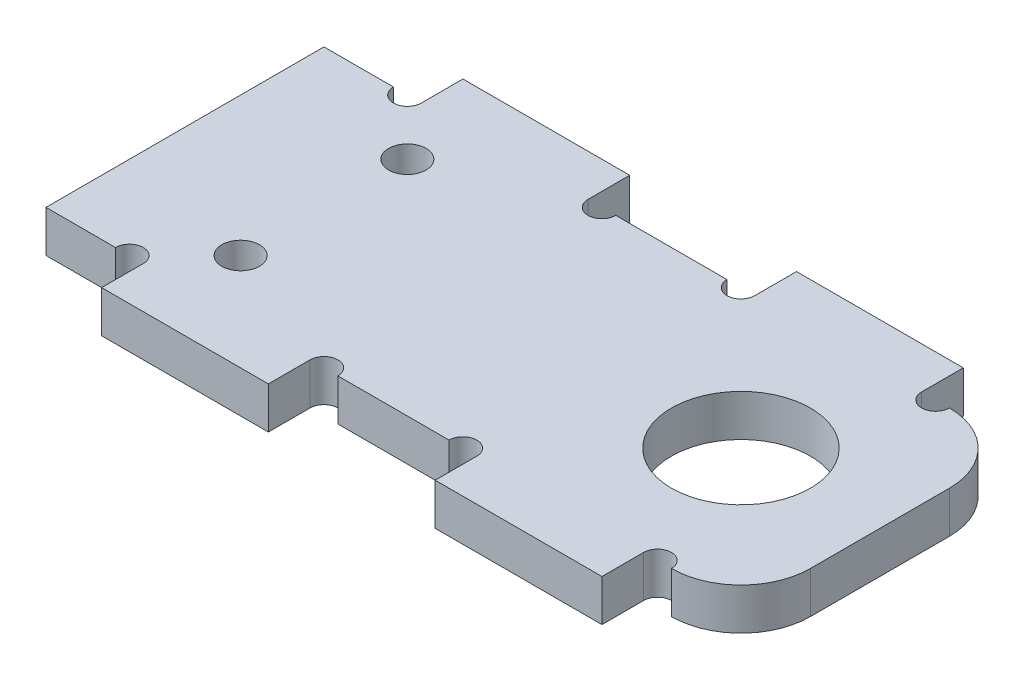
ISO-10303-21;
HEADER;
FILE_DESCRIPTION(('STEP AP214'),'2;1');
FILE_NAME('part.step','',(''),(''),'','','');
FILE_SCHEMA(('AUTOMOTIVE_DESIGN { 1 0 10303 214 1 1 1 1 }'));
ENDSEC;
DATA;
#1=APPLICATION_CONTEXT('core data for automotive mechanical design processes');
#2=APPLICATION_PROTOCOL_DEFINITION('international standard','automotive_design',2000,#1);
#3=PRODUCT_CONTEXT('',#1,'mechanical');
#4=PRODUCT('Part','Part','',(#3));
#5=PRODUCT_RELATED_PRODUCT_CATEGORY('part','',(#4));
#6=PRODUCT_DEFINITION_FORMATION('','',#4);
#7=PRODUCT_DEFINITION_CONTEXT('part definition',#1,'design');
#8=PRODUCT_DEFINITION('design','',#6,#7);
#9=PRODUCT_DEFINITION_SHAPE('','',#8);
#10=(LENGTH_UNIT() NAMED_UNIT(*) SI_UNIT(.MILLI.,.METRE.));
#11=(NAMED_UNIT(*) PLANE_ANGLE_UNIT() SI_UNIT($,.RADIAN.));
#12=(NAMED_UNIT(*) SI_UNIT($,.STERADIAN.) SOLID_ANGLE_UNIT());
#13=UNCERTAINTY_MEASURE_WITH_UNIT(LENGTH_MEASURE(1.E-05),#10,'distance_accuracy_value','');
#14=(GEOMETRIC_REPRESENTATION_CONTEXT(3) GLOBAL_UNCERTAINTY_ASSIGNED_CONTEXT((#13)) GLOBAL_UNIT_ASSIGNED_CONTEXT((#10,
#11,#12)) REPRESENTATION_CONTEXT('',''));
#15=CARTESIAN_POINT('',(0.,0.,0.));
#16=DIRECTION('',(0.,0.,1.));
#17=DIRECTION('',(1.,0.,0.));
#18=AXIS2_PLACEMENT_3D('',#15,#16,#17);
#19=CARTESIAN_POINT('',(-30.,3.,-10.));
#20=DIRECTION('',(0.,0.,1.));
#21=DIRECTION('',(1.,0.,0.));
#22=AXIS2_PLACEMENT_3D('',#19,#20,#21);
#23=PLANE('',#22);
#24=DIRECTION('',(-1.,0.,0.));
#25=VECTOR('',#24,1.);
#26=CARTESIAN_POINT('',(-10.,3.,-10.));
#27=LINE('',#26,#25);
#28=CARTESIAN_POINT('',(-35.,3.,-10.));
#29=VERTEX_POINT('',#28);
#30=CARTESIAN_POINT('',(-40.,3.,-10.));
#31=VERTEX_POINT('',#30);
#32=EDGE_CURVE('E442',#29,#31,#27,.T.);
#33=ORIENTED_EDGE('',*,*,#32,.F.);
#34=DIRECTION('',(0.,-1.,0.));
#35=VECTOR('',#34,1.);
#36=CARTESIAN_POINT('',(-35.,3.,-10.));
#37=LINE('',#36,#35);
#38=CARTESIAN_POINT('',(-35.,0.,-10.));
#39=VERTEX_POINT('',#38);
#40=EDGE_CURVE('E229',#29,#39,#37,.T.);
#41=ORIENTED_EDGE('',*,*,#40,.T.);
#42=DIRECTION('',(-1.,0.,0.));
#43=VECTOR('',#42,1.);
#44=CARTESIAN_POINT('',(-30.,0.,-10.));
#45=LINE('',#44,#43);
#46=CARTESIAN_POINT('',(-40.,0.,-10.));
#47=VERTEX_POINT('',#46);
#48=EDGE_CURVE('E248',#39,#47,#45,.T.);
#49=ORIENTED_EDGE('',*,*,#48,.T.);
#50=DIRECTION('',(0.,-1.,0.));
#51=VECTOR('',#50,1.);
#52=CARTESIAN_POINT('',(-40.,3.,-10.));
#53=LINE('',#52,#51);
#54=EDGE_CURVE('E264',#31,#47,#53,.T.);
#55=ORIENTED_EDGE('',*,*,#54,.F.);
#56=EDGE_LOOP('',(#33,#41,#49,#55));
#57=FACE_BOUND('',#56,.T.);
#58=ADVANCED_FACE('F35',(#57),#23,.F.);
#59=CARTESIAN_POINT('',(-10.,3.,10.));
#60=DIRECTION('',(0.,0.,-1.));
#61=DIRECTION('',(-1.,0.,0.));
#62=AXIS2_PLACEMENT_3D('',#59,#60,#61);
#63=PLANE('',#62);
#64=DIRECTION('',(1.,0.,0.));
#65=VECTOR('',#64,1.);
#66=CARTESIAN_POINT('',(-10.,0.,10.));
#67=LINE('',#66,#65);
#68=CARTESIAN_POINT('',(-40.,0.,10.));
#69=VERTEX_POINT('',#68);
#70=CARTESIAN_POINT('',(-35.,0.,10.));
#71=VERTEX_POINT('',#70);
#72=EDGE_CURVE('E257',#69,#71,#67,.T.);
#73=ORIENTED_EDGE('',*,*,#72,.T.);
#74=DIRECTION('',(0.,-1.,0.));
#75=VECTOR('',#74,1.);
#76=CARTESIAN_POINT('',(-35.,3.,10.));
#77=LINE('',#76,#75);
#78=CARTESIAN_POINT('',(-35.,3.,10.));
#79=VERTEX_POINT('',#78);
#80=EDGE_CURVE('E329',#71,#79,#77,.F.);
#81=ORIENTED_EDGE('',*,*,#80,.T.);
#82=DIRECTION('',(1.,0.,0.));
#83=VECTOR('',#82,1.);
#84=CARTESIAN_POINT('',(-40.,3.,10.));
#85=LINE('',#84,#83);
#86=CARTESIAN_POINT('',(-40.,3.,10.));
#87=VERTEX_POINT('',#86);
#88=EDGE_CURVE('E265',#87,#79,#85,.T.);
#89=ORIENTED_EDGE('',*,*,#88,.F.);
#90=DIRECTION('',(0.,-1.,0.));
#91=VECTOR('',#90,1.);
#92=CARTESIAN_POINT('',(-40.,3.,10.));
#93=LINE('',#92,#91);
#94=EDGE_CURVE('E261',#87,#69,#93,.T.);
#95=ORIENTED_EDGE('',*,*,#94,.T.);
#96=EDGE_LOOP('',(#73,#81,#89,#95));
#97=FACE_BOUND('',#96,.T.);
#98=ADVANCED_FACE('F492',(#97),#63,.F.);
#99=CARTESIAN_POINT('',(0.,3.,0.));
#100=DIRECTION('',(0.,-1.,0.));
#101=DIRECTION('',(0.,0.,-1.));
#102=AXIS2_PLACEMENT_3D('',#99,#100,#101);
#103=PLANE('',#102);
#104=DIRECTION('',(0.,0.,-1.));
#105=VECTOR('',#104,1.);
#106=CARTESIAN_POINT('',(-21.,3.,10.));
#107=LINE('',#106,#105);
#108=CARTESIAN_POINT('',(-21.,3.,13.));
#109=VERTEX_POINT('',#108);
#110=CARTESIAN_POINT('',(-21.,3.,10.));
#111=VERTEX_POINT('',#110);
#112=EDGE_CURVE('E400',#109,#111,#107,.T.);
#113=ORIENTED_EDGE('',*,*,#112,.T.);
#114=CARTESIAN_POINT('',(-20.,3.,10.));
#115=DIRECTION('',(0.,-1.,0.));
#116=DIRECTION('',(0.,0.,1.));
#117=AXIS2_PLACEMENT_3D('',#114,#115,#116);
#118=CIRCLE('',#117,1.);
#119=CARTESIAN_POINT('',(-19.,3.,10.));
#120=VERTEX_POINT('',#119);
#121=EDGE_CURVE('E318',#111,#120,#118,.T.);
#122=ORIENTED_EDGE('',*,*,#121,.T.);
#123=CARTESIAN_POINT('',(-11.,3.,10.));
#124=VERTEX_POINT('',#123);
#125=EDGE_CURVE('E446',#120,#124,#85,.T.);
#126=ORIENTED_EDGE('',*,*,#125,.T.);
#127=CARTESIAN_POINT('',(-10.,3.,10.));
#128=DIRECTION('',(0.,-1.,0.));
#129=DIRECTION('',(0.,0.,-1.));
#130=AXIS2_PLACEMENT_3D('',#127,#128,#129);
#131=CIRCLE('',#130,1.);
#132=CARTESIAN_POINT('',(-9.,3.,10.));
#133=VERTEX_POINT('',#132);
#134=EDGE_CURVE('E453',#124,#133,#131,.T.);
#135=ORIENTED_EDGE('',*,*,#134,.T.);
#136=DIRECTION('',(0.,0.,1.));
#137=VECTOR('',#136,1.);
#138=CARTESIAN_POINT('',(-9.,3.,10.));
#139=LINE('',#138,#137);
#140=CARTESIAN_POINT('',(-9.,3.,13.));
#141=VERTEX_POINT('',#140);
#142=EDGE_CURVE('E375',#133,#141,#139,.T.);
#143=ORIENTED_EDGE('',*,*,#142,.T.);
#144=DIRECTION('',(1.,0.,0.));
#145=VECTOR('',#144,1.);
#146=CARTESIAN_POINT('',(3.,3.,13.));
#147=LINE('',#146,#145);
#148=CARTESIAN_POINT('',(3.,3.,13.));
#149=VERTEX_POINT('',#148);
#150=EDGE_CURVE('E381',#141,#149,#147,.T.);
#151=ORIENTED_EDGE('',*,*,#150,.T.);
#152=DIRECTION('',(0.,0.,-1.));
#153=VECTOR('',#152,1.);
#154=CARTESIAN_POINT('',(3.,3.,10.));
#155=LINE('',#154,#153);
#156=CARTESIAN_POINT('',(3.,3.,10.));
#157=VERTEX_POINT('',#156);
#158=EDGE_CURVE('E377',#149,#157,#155,.T.);
#159=ORIENTED_EDGE('',*,*,#158,.T.);
#160=CARTESIAN_POINT('',(3.99999999999999,3.,10.));
#161=DIRECTION('',(0.,-1.,0.));
#162=DIRECTION('',(0.,0.,1.));
#163=AXIS2_PLACEMENT_3D('',#160,#161,#162);
#164=CIRCLE('',#163,1.);
#165=CARTESIAN_POINT('',(4.99999999999999,3.,10.));
#166=VERTEX_POINT('',#165);
#167=EDGE_CURVE('E464',#157,#166,#164,.T.);
#168=ORIENTED_EDGE('',*,*,#167,.T.);
#169=CARTESIAN_POINT('',(5.,3.,5.));
#170=DIRECTION('',(0.,-1.,0.));
#171=DIRECTION('',(0.,0.,-1.));
#172=AXIS2_PLACEMENT_3D('',#169,#170,#171);
#173=CIRCLE('',#172,5.);
#174=CARTESIAN_POINT('',(10.,3.,5.));
#175=VERTEX_POINT('',#174);
#176=EDGE_CURVE('E280',#166,#175,#173,.F.);
#177=ORIENTED_EDGE('',*,*,#176,.T.);
#178=DIRECTION('',(0.,0.,-1.));
#179=VECTOR('',#178,1.);
#180=CARTESIAN_POINT('',(10.,3.,10.));
#181=LINE('',#180,#179);
#182=CARTESIAN_POINT('',(10.,3.,-5.));
#183=VERTEX_POINT('',#182);
#184=EDGE_CURVE('E260',#175,#183,#181,.T.);
#185=ORIENTED_EDGE('',*,*,#184,.T.);
#186=CARTESIAN_POINT('',(5.,3.,-5.));
#187=DIRECTION('',(0.,-1.,0.));
#188=DIRECTION('',(0.,0.,-1.));
#189=AXIS2_PLACEMENT_3D('',#186,#187,#188);
#190=CIRCLE('',#189,5.);
#191=CARTESIAN_POINT('',(5.,3.,-10.));
#192=VERTEX_POINT('',#191);
#193=EDGE_CURVE('E43',#183,#192,#190,.F.);
#194=ORIENTED_EDGE('',*,*,#193,.T.);
#195=CARTESIAN_POINT('',(4.,3.,-10.));
#196=DIRECTION('',(0.,-1.,0.));
#197=DIRECTION('',(0.,0.,-1.));
#198=AXIS2_PLACEMENT_3D('',#195,#196,#197);
#199=CIRCLE('',#198,1.);
#200=CARTESIAN_POINT('',(3.,3.,-10.));
#201=VERTEX_POINT('',#200);
#202=EDGE_CURVE('E290',#192,#201,#199,.T.);
#203=ORIENTED_EDGE('',*,*,#202,.T.);
#204=DIRECTION('',(0.,0.,-1.));
#205=VECTOR('',#204,1.);
#206=CARTESIAN_POINT('',(3.,3.,-10.));
#207=LINE('',#206,#205);
#208=CARTESIAN_POINT('',(3.,3.,-13.));
#209=VERTEX_POINT('',#208);
#210=EDGE_CURVE('E356',#201,#209,#207,.T.);
#211=ORIENTED_EDGE('',*,*,#210,.T.);
#212=DIRECTION('',(-1.,0.,0.));
#213=VECTOR('',#212,1.);
#214=CARTESIAN_POINT('',(3.,3.,-13.));
#215=LINE('',#214,#213);
#216=CARTESIAN_POINT('',(-9.,3.,-13.));
#217=VERTEX_POINT('',#216);
#218=EDGE_CURVE('E354',#209,#217,#215,.T.);
#219=ORIENTED_EDGE('',*,*,#218,.T.);
#220=DIRECTION('',(0.,0.,1.));
#221=VECTOR('',#220,1.);
#222=CARTESIAN_POINT('',(-9.,3.,-10.));
#223=LINE('',#222,#221);
#224=CARTESIAN_POINT('',(-9.,3.,-10.));
#225=VERTEX_POINT('',#224);
#226=EDGE_CURVE('E359',#217,#225,#223,.T.);
#227=ORIENTED_EDGE('',*,*,#226,.T.);
#228=CARTESIAN_POINT('',(-10.,3.,-10.));
#229=DIRECTION('',(0.,-1.,0.));
#230=DIRECTION('',(0.,0.,1.));
#231=AXIS2_PLACEMENT_3D('',#228,#229,#230);
#232=CIRCLE('',#231,1.00000000000001);
#233=CARTESIAN_POINT('',(-11.,3.,-10.));
#234=VERTEX_POINT('',#233);
#235=EDGE_CURVE('E58',#225,#234,#232,.T.);
#236=ORIENTED_EDGE('',*,*,#235,.T.);
#237=CARTESIAN_POINT('',(-19.,3.,-10.));
#238=VERTEX_POINT('',#237);
#239=EDGE_CURVE('E444',#234,#238,#27,.T.);
#240=ORIENTED_EDGE('',*,*,#239,.T.);
#241=CARTESIAN_POINT('',(-20.,3.,-10.));
#242=DIRECTION('',(0.,-1.,0.));
#243=DIRECTION('',(0.,0.,-1.));
#244=AXIS2_PLACEMENT_3D('',#241,#242,#243);
#245=CIRCLE('',#244,1.00000000000001);
#246=CARTESIAN_POINT('',(-21.,3.,-10.));
#247=VERTEX_POINT('',#246);
#248=EDGE_CURVE('E224',#238,#247,#245,.T.);
#249=ORIENTED_EDGE('',*,*,#248,.T.);
#250=DIRECTION('',(0.,0.,-1.));
#251=VECTOR('',#250,1.);
#252=CARTESIAN_POINT('',(-21.,3.,-10.));
#253=LINE('',#252,#251);
#254=CARTESIAN_POINT('',(-21.,3.,-13.));
#255=VERTEX_POINT('',#254);
#256=EDGE_CURVE('E333',#247,#255,#253,.T.);
#257=ORIENTED_EDGE('',*,*,#256,.T.);
#258=DIRECTION('',(-1.,0.,0.));
#259=VECTOR('',#258,1.);
#260=CARTESIAN_POINT('',(-33.,3.,-13.));
#261=LINE('',#260,#259);
#262=CARTESIAN_POINT('',(-33.,3.,-13.));
#263=VERTEX_POINT('',#262);
#264=EDGE_CURVE('E339',#255,#263,#261,.T.);
#265=ORIENTED_EDGE('',*,*,#264,.T.);
#266=DIRECTION('',(0.,0.,1.));
#267=VECTOR('',#266,1.);
#268=CARTESIAN_POINT('',(-33.,3.,-10.));
#269=LINE('',#268,#267);
#270=CARTESIAN_POINT('',(-33.,3.,-10.));
#271=VERTEX_POINT('',#270);
#272=EDGE_CURVE('E335',#263,#271,#269,.T.);
#273=ORIENTED_EDGE('',*,*,#272,.T.);
#274=CARTESIAN_POINT('',(-34.,3.,-10.));
#275=DIRECTION('',(0.,-1.,0.));
#276=DIRECTION('',(0.,0.,1.));
#277=AXIS2_PLACEMENT_3D('',#274,#275,#276);
#278=CIRCLE('',#277,0.999999999999998);
#279=EDGE_CURVE('E50',#271,#29,#278,.T.);
#280=ORIENTED_EDGE('',*,*,#279,.T.);
#281=ORIENTED_EDGE('',*,*,#32,.T.);
#282=DIRECTION('',(0.,0.,1.));
#283=VECTOR('',#282,1.);
#284=CARTESIAN_POINT('',(-40.,3.,-10.));
#285=LINE('',#284,#283);
#286=EDGE_CURVE('E445',#31,#87,#285,.T.);
#287=ORIENTED_EDGE('',*,*,#286,.T.);
#288=ORIENTED_EDGE('',*,*,#88,.T.);
#289=CARTESIAN_POINT('',(-34.,3.,10.));
#290=DIRECTION('',(0.,-1.,0.));
#291=DIRECTION('',(0.,0.,-1.));
#292=AXIS2_PLACEMENT_3D('',#289,#290,#291);
#293=CIRCLE('',#292,0.999999999999998);
#294=CARTESIAN_POINT('',(-33.,3.,10.));
#295=VERTEX_POINT('',#294);
#296=EDGE_CURVE('E230',#79,#295,#293,.T.);
#297=ORIENTED_EDGE('',*,*,#296,.T.);
#298=DIRECTION('',(0.,0.,1.));
#299=VECTOR('',#298,1.);
#300=CARTESIAN_POINT('',(-33.,3.,10.));
#301=LINE('',#300,#299);
#302=CARTESIAN_POINT('',(-33.,3.,13.));
#303=VERTEX_POINT('',#302);
#304=EDGE_CURVE('E405',#295,#303,#301,.T.);
#305=ORIENTED_EDGE('',*,*,#304,.T.);
#306=DIRECTION('',(1.,0.,0.));
#307=VECTOR('',#306,1.);
#308=CARTESIAN_POINT('',(-33.,3.,13.));
#309=LINE('',#308,#307);
#310=EDGE_CURVE('E402',#303,#109,#309,.T.);
#311=ORIENTED_EDGE('',*,*,#310,.T.);
#312=EDGE_LOOP('',(#113,#122,#126,#135,#143,#151,#159,#168,#177,#185,#194,#203,#211,#219,#227,
#236,#240,#249,#257,#265,#273,#280,#281,#287,#288,#297,#305,#311));
#313=FACE_BOUND('',#312,.T.);
#314=CARTESIAN_POINT('',(0.,3.,0.));
#315=DIRECTION('',(0.,1.,0.));
#316=DIRECTION('',(0.,0.,1.));
#317=AXIS2_PLACEMENT_3D('',#314,#315,#316);
#318=CIRCLE('',#317,5.);
#319=CARTESIAN_POINT('',(0.,3.,5.));
#320=VERTEX_POINT('',#319);
#321=EDGE_CURVE('E436',#320,#320,#318,.T.);
#322=ORIENTED_EDGE('',*,*,#321,.F.);
#323=EDGE_LOOP('',(#322));
#324=FACE_BOUND('',#323,.T.);
#325=CARTESIAN_POINT('',(-30.,3.,-6.));
#326=DIRECTION('',(0.,1.,0.));
#327=DIRECTION('',(0.,0.,-1.));
#328=AXIS2_PLACEMENT_3D('',#325,#326,#327);
#329=CIRCLE('',#328,1.35);
#330=CARTESIAN_POINT('',(-30.,3.,-7.35));
#331=VERTEX_POINT('',#330);
#332=EDGE_CURVE('E430',#331,#331,#329,.T.);
#333=ORIENTED_EDGE('',*,*,#332,.F.);
#334=EDGE_LOOP('',(#333));
#335=FACE_BOUND('',#334,.T.);
#336=CARTESIAN_POINT('',(-30.,3.,6.));
#337=DIRECTION('',(0.,1.,0.));
#338=DIRECTION('',(0.,0.,1.));
#339=AXIS2_PLACEMENT_3D('',#336,#337,#338);
#340=CIRCLE('',#339,1.35);
#341=CARTESIAN_POINT('',(-30.,3.,7.35));
#342=VERTEX_POINT('',#341);
#343=EDGE_CURVE('E424',#342,#342,#340,.T.);
#344=ORIENTED_EDGE('',*,*,#343,.F.);
#345=EDGE_LOOP('',(#344));
#346=FACE_BOUND('',#345,.T.);
#347=ADVANCED_FACE('F288',(#313,#324,#335,#346),#103,.F.);
#348=CARTESIAN_POINT('',(0.,0.,0.));
#349=DIRECTION('',(0.,-1.,0.));
#350=DIRECTION('',(0.,0.,-1.));
#351=AXIS2_PLACEMENT_3D('',#348,#349,#350);
#352=PLANE('',#351);
#353=CARTESIAN_POINT('',(-20.,0.,10.));
#354=DIRECTION('',(0.,-1.,0.));
#355=DIRECTION('',(0.,0.,1.));
#356=AXIS2_PLACEMENT_3D('',#353,#354,#355);
#357=CIRCLE('',#356,1.);
#358=CARTESIAN_POINT('',(-21.,0.,10.));
#359=VERTEX_POINT('',#358);
#360=CARTESIAN_POINT('',(-19.,0.,10.));
#361=VERTEX_POINT('',#360);
#362=EDGE_CURVE('E466',#359,#361,#357,.T.);
#363=ORIENTED_EDGE('',*,*,#362,.F.);
#364=DIRECTION('',(0.,0.,1.));
#365=VECTOR('',#364,1.);
#366=CARTESIAN_POINT('',(-21.,0.,10.));
#367=LINE('',#366,#365);
#368=CARTESIAN_POINT('',(-21.,0.,13.));
#369=VERTEX_POINT('',#368);
#370=EDGE_CURVE('E410',#359,#369,#367,.T.);
#371=ORIENTED_EDGE('',*,*,#370,.T.);
#372=DIRECTION('',(-1.,0.,0.));
#373=VECTOR('',#372,1.);
#374=CARTESIAN_POINT('',(-33.,0.,13.));
#375=LINE('',#374,#373);
#376=CARTESIAN_POINT('',(-33.,0.,13.));
#377=VERTEX_POINT('',#376);
#378=EDGE_CURVE('E413',#369,#377,#375,.T.);
#379=ORIENTED_EDGE('',*,*,#378,.T.);
#380=DIRECTION('',(0.,0.,-1.));
#381=VECTOR('',#380,1.);
#382=CARTESIAN_POINT('',(-33.,0.,10.));
#383=LINE('',#382,#381);
#384=CARTESIAN_POINT('',(-33.,0.,10.));
#385=VERTEX_POINT('',#384);
#386=EDGE_CURVE('E399',#377,#385,#383,.T.);
#387=ORIENTED_EDGE('',*,*,#386,.T.);
#388=CARTESIAN_POINT('',(-34.,0.,10.));
#389=DIRECTION('',(0.,-1.,0.));
#390=DIRECTION('',(0.,0.,-1.));
#391=AXIS2_PLACEMENT_3D('',#388,#389,#390);
#392=CIRCLE('',#391,0.999999999999998);
#393=EDGE_CURVE('E317',#71,#385,#392,.T.);
#394=ORIENTED_EDGE('',*,*,#393,.F.);
#395=ORIENTED_EDGE('',*,*,#72,.F.);
#396=DIRECTION('',(0.,0.,1.));
#397=VECTOR('',#396,1.);
#398=CARTESIAN_POINT('',(-40.,0.,-10.));
#399=LINE('',#398,#397);
#400=EDGE_CURVE('E247',#47,#69,#399,.T.);
#401=ORIENTED_EDGE('',*,*,#400,.F.);
#402=ORIENTED_EDGE('',*,*,#48,.F.);
#403=CARTESIAN_POINT('',(-34.,0.,-10.));
#404=DIRECTION('',(0.,-1.,0.));
#405=DIRECTION('',(0.,0.,1.));
#406=AXIS2_PLACEMENT_3D('',#403,#404,#405);
#407=CIRCLE('',#406,0.999999999999998);
#408=CARTESIAN_POINT('',(-33.,0.,-10.));
#409=VERTEX_POINT('',#408);
#410=EDGE_CURVE('E844',#409,#39,#407,.T.);
#411=ORIENTED_EDGE('',*,*,#410,.F.);
#412=DIRECTION('',(0.,0.,-1.));
#413=VECTOR('',#412,1.);
#414=CARTESIAN_POINT('',(-33.,0.,-10.));
#415=LINE('',#414,#413);
#416=CARTESIAN_POINT('',(-33.,0.,-13.));
#417=VERTEX_POINT('',#416);
#418=EDGE_CURVE('E332',#409,#417,#415,.T.);
#419=ORIENTED_EDGE('',*,*,#418,.T.);
#420=DIRECTION('',(1.,0.,0.));
#421=VECTOR('',#420,1.);
#422=CARTESIAN_POINT('',(-33.,0.,-13.));
#423=LINE('',#422,#421);
#424=CARTESIAN_POINT('',(-21.,0.,-13.));
#425=VERTEX_POINT('',#424);
#426=EDGE_CURVE('E342',#417,#425,#423,.T.);
#427=ORIENTED_EDGE('',*,*,#426,.T.);
#428=DIRECTION('',(0.,0.,1.));
#429=VECTOR('',#428,1.);
#430=CARTESIAN_POINT('',(-21.,0.,-10.));
#431=LINE('',#430,#429);
#432=CARTESIAN_POINT('',(-21.,0.,-10.));
#433=VERTEX_POINT('',#432);
#434=EDGE_CURVE('E242',#425,#433,#431,.T.);
#435=ORIENTED_EDGE('',*,*,#434,.T.);
#436=CARTESIAN_POINT('',(-20.,0.,-10.));
#437=DIRECTION('',(0.,-1.,0.));
#438=DIRECTION('',(0.,0.,-1.));
#439=AXIS2_PLACEMENT_3D('',#436,#437,#438);
#440=CIRCLE('',#439,1.00000000000001);
#441=CARTESIAN_POINT('',(-19.,0.,-10.));
#442=VERTEX_POINT('',#441);
#443=EDGE_CURVE('E221',#442,#433,#440,.T.);
#444=ORIENTED_EDGE('',*,*,#443,.F.);
#445=CARTESIAN_POINT('',(-11.,0.,-10.));
#446=VERTEX_POINT('',#445);
#447=EDGE_CURVE('E239',#446,#442,#45,.T.);
#448=ORIENTED_EDGE('',*,*,#447,.F.);
#449=CARTESIAN_POINT('',(-10.,0.,-10.));
#450=DIRECTION('',(0.,-1.,0.));
#451=DIRECTION('',(0.,0.,1.));
#452=AXIS2_PLACEMENT_3D('',#449,#450,#451);
#453=CIRCLE('',#452,1.00000000000001);
#454=CARTESIAN_POINT('',(-9.,0.,-10.));
#455=VERTEX_POINT('',#454);
#456=EDGE_CURVE('E311',#455,#446,#453,.T.);
#457=ORIENTED_EDGE('',*,*,#456,.F.);
#458=DIRECTION('',(0.,0.,-1.));
#459=VECTOR('',#458,1.);
#460=CARTESIAN_POINT('',(-9.,0.,-10.));
#461=LINE('',#460,#459);
#462=CARTESIAN_POINT('',(-9.,0.,-13.));
#463=VERTEX_POINT('',#462);
#464=EDGE_CURVE('E353',#455,#463,#461,.T.);
#465=ORIENTED_EDGE('',*,*,#464,.T.);
#466=DIRECTION('',(1.,0.,0.));
#467=VECTOR('',#466,1.);
#468=CARTESIAN_POINT('',(3.,0.,-13.));
#469=LINE('',#468,#467);
#470=CARTESIAN_POINT('',(3.,0.,-13.));
#471=VERTEX_POINT('',#470);
#472=EDGE_CURVE('E362',#463,#471,#469,.T.);
#473=ORIENTED_EDGE('',*,*,#472,.T.);
#474=DIRECTION('',(0.,0.,1.));
#475=VECTOR('',#474,1.);
#476=CARTESIAN_POINT('',(3.,0.,-10.));
#477=LINE('',#476,#475);
#478=CARTESIAN_POINT('',(3.,0.,-10.));
#479=VERTEX_POINT('',#478);
#480=EDGE_CURVE('E307',#471,#479,#477,.T.);
#481=ORIENTED_EDGE('',*,*,#480,.T.);
#482=CARTESIAN_POINT('',(4.,0.,-10.));
#483=DIRECTION('',(0.,-1.,0.));
#484=DIRECTION('',(0.,0.,-1.));
#485=AXIS2_PLACEMENT_3D('',#482,#483,#484);
#486=CIRCLE('',#485,1.);
#487=CARTESIAN_POINT('',(5.,0.,-10.));
#488=VERTEX_POINT('',#487);
#489=EDGE_CURVE('E300',#488,#479,#486,.T.);
#490=ORIENTED_EDGE('',*,*,#489,.F.);
#491=CARTESIAN_POINT('',(5.,0.,-5.));
#492=DIRECTION('',(0.,-1.,0.));
#493=DIRECTION('',(0.,0.,-1.));
#494=AXIS2_PLACEMENT_3D('',#491,#492,#493);
#495=CIRCLE('',#494,5.);
#496=CARTESIAN_POINT('',(10.,0.,-5.));
#497=VERTEX_POINT('',#496);
#498=EDGE_CURVE('E273',#488,#497,#495,.T.);
#499=ORIENTED_EDGE('',*,*,#498,.T.);
#500=DIRECTION('',(0.,0.,-1.));
#501=VECTOR('',#500,1.);
#502=CARTESIAN_POINT('',(10.,0.,10.));
#503=LINE('',#502,#501);
#504=CARTESIAN_POINT('',(10.,0.,5.));
#505=VERTEX_POINT('',#504);
#506=EDGE_CURVE('E253',#505,#497,#503,.T.);
#507=ORIENTED_EDGE('',*,*,#506,.F.);
#508=CARTESIAN_POINT('',(5.,0.,5.));
#509=DIRECTION('',(0.,-1.,0.));
#510=DIRECTION('',(0.,0.,-1.));
#511=AXIS2_PLACEMENT_3D('',#508,#509,#510);
#512=CIRCLE('',#511,5.);
#513=CARTESIAN_POINT('',(4.99999999999999,0.,10.));
#514=VERTEX_POINT('',#513);
#515=EDGE_CURVE('E270',#505,#514,#512,.T.);
#516=ORIENTED_EDGE('',*,*,#515,.T.);
#517=CARTESIAN_POINT('',(3.99999999999999,0.,10.));
#518=DIRECTION('',(0.,-1.,0.));
#519=DIRECTION('',(0.,0.,1.));
#520=AXIS2_PLACEMENT_3D('',#517,#518,#519);
#521=CIRCLE('',#520,1.);
#522=CARTESIAN_POINT('',(3.,0.,10.));
#523=VERTEX_POINT('',#522);
#524=EDGE_CURVE('E309',#523,#514,#521,.T.);
#525=ORIENTED_EDGE('',*,*,#524,.F.);
#526=DIRECTION('',(0.,0.,1.));
#527=VECTOR('',#526,1.);
#528=CARTESIAN_POINT('',(3.,0.,10.));
#529=LINE('',#528,#527);
#530=CARTESIAN_POINT('',(3.,0.,13.));
#531=VERTEX_POINT('',#530);
#532=EDGE_CURVE('E374',#523,#531,#529,.T.);
#533=ORIENTED_EDGE('',*,*,#532,.T.);
#534=DIRECTION('',(-1.,0.,0.));
#535=VECTOR('',#534,1.);
#536=CARTESIAN_POINT('',(3.,0.,13.));
#537=LINE('',#536,#535);
#538=CARTESIAN_POINT('',(-9.,0.,13.));
#539=VERTEX_POINT('',#538);
#540=EDGE_CURVE('E384',#531,#539,#537,.T.);
#541=ORIENTED_EDGE('',*,*,#540,.T.);
#542=DIRECTION('',(0.,0.,-1.));
#543=VECTOR('',#542,1.);
#544=CARTESIAN_POINT('',(-9.,0.,10.));
#545=LINE('',#544,#543);
#546=CARTESIAN_POINT('',(-9.,0.,10.));
#547=VERTEX_POINT('',#546);
#548=EDGE_CURVE('E387',#539,#547,#545,.T.);
#549=ORIENTED_EDGE('',*,*,#548,.T.);
#550=CARTESIAN_POINT('',(-10.,0.,10.));
#551=DIRECTION('',(0.,-1.,0.));
#552=DIRECTION('',(0.,0.,-1.));
#553=AXIS2_PLACEMENT_3D('',#550,#551,#552);
#554=CIRCLE('',#553,1.);
#555=CARTESIAN_POINT('',(-11.,0.,10.));
#556=VERTEX_POINT('',#555);
#557=EDGE_CURVE('E462',#556,#547,#554,.T.);
#558=ORIENTED_EDGE('',*,*,#557,.F.);
#559=EDGE_CURVE('E251',#361,#556,#67,.T.);
#560=ORIENTED_EDGE('',*,*,#559,.F.);
#561=EDGE_LOOP('',(#363,#371,#379,#387,#394,#395,#401,#402,#411,#419,#427,#435,#444,#448,#457,
#465,#473,#481,#490,#499,#507,#516,#525,#533,#541,#549,#558,#560));
#562=FACE_BOUND('',#561,.T.);
#563=CARTESIAN_POINT('',(-30.,0.,-6.));
#564=DIRECTION('',(0.,1.,0.));
#565=DIRECTION('',(0.,0.,-1.));
#566=AXIS2_PLACEMENT_3D('',#563,#564,#565);
#567=CIRCLE('',#566,1.35);
#568=CARTESIAN_POINT('',(-30.,0.,-7.35));
#569=VERTEX_POINT('',#568);
#570=EDGE_CURVE('E427',#569,#569,#567,.T.);
#571=ORIENTED_EDGE('',*,*,#570,.T.);
#572=EDGE_LOOP('',(#571));
#573=FACE_BOUND('',#572,.T.);
#574=CARTESIAN_POINT('',(0.,0.,0.));
#575=DIRECTION('',(0.,1.,0.));
#576=DIRECTION('',(0.,0.,1.));
#577=AXIS2_PLACEMENT_3D('',#574,#575,#576);
#578=CIRCLE('',#577,5.);
#579=CARTESIAN_POINT('',(0.,0.,5.));
#580=VERTEX_POINT('',#579);
#581=EDGE_CURVE('E433',#580,#580,#578,.T.);
#582=ORIENTED_EDGE('',*,*,#581,.T.);
#583=EDGE_LOOP('',(#582));
#584=FACE_BOUND('',#583,.T.);
#585=CARTESIAN_POINT('',(-30.,0.,6.));
#586=DIRECTION('',(0.,1.,0.));
#587=DIRECTION('',(0.,0.,1.));
#588=AXIS2_PLACEMENT_3D('',#585,#586,#587);
#589=CIRCLE('',#588,1.35);
#590=CARTESIAN_POINT('',(-30.,0.,7.35));
#591=VERTEX_POINT('',#590);
#592=EDGE_CURVE('E407',#591,#591,#589,.T.);
#593=ORIENTED_EDGE('',*,*,#592,.T.);
#594=EDGE_LOOP('',(#593));
#595=FACE_BOUND('',#594,.T.);
#596=ADVANCED_FACE('F236',(#562,#573,#584,#595),#352,.T.);
#597=CARTESIAN_POINT('',(10.,3.,10.));
#598=DIRECTION('',(-1.,0.,0.));
#599=DIRECTION('',(0.,0.,1.));
#600=AXIS2_PLACEMENT_3D('',#597,#598,#599);
#601=PLANE('',#600);
#602=ORIENTED_EDGE('',*,*,#506,.T.);
#603=DIRECTION('',(0.,-1.,0.));
#604=VECTOR('',#603,1.);
#605=CARTESIAN_POINT('',(10.,3.,-5.));
#606=LINE('',#605,#604);
#607=EDGE_CURVE('E278',#497,#183,#606,.F.);
#608=ORIENTED_EDGE('',*,*,#607,.T.);
#609=ORIENTED_EDGE('',*,*,#184,.F.);
#610=DIRECTION('',(0.,-1.,0.));
#611=VECTOR('',#610,1.);
#612=CARTESIAN_POINT('',(10.,3.,5.));
#613=LINE('',#612,#611);
#614=EDGE_CURVE('E275',#175,#505,#613,.T.);
#615=ORIENTED_EDGE('',*,*,#614,.T.);
#616=EDGE_LOOP('',(#602,#608,#609,#615));
#617=FACE_BOUND('',#616,.T.);
#618=ADVANCED_FACE('F481',(#617),#601,.F.);
#619=ORIENTED_EDGE('',*,*,#239,.F.);
#620=DIRECTION('',(0.,-1.,0.));
#621=VECTOR('',#620,1.);
#622=CARTESIAN_POINT('',(-11.,3.,-10.));
#623=LINE('',#622,#621);
#624=EDGE_CURVE('E246',#234,#446,#623,.T.);
#625=ORIENTED_EDGE('',*,*,#624,.T.);
#626=ORIENTED_EDGE('',*,*,#447,.T.);
#627=DIRECTION('',(0.,-1.,0.));
#628=VECTOR('',#627,1.);
#629=CARTESIAN_POINT('',(-19.,3.,-10.));
#630=LINE('',#629,#628);
#631=EDGE_CURVE('E218',#442,#238,#630,.F.);
#632=ORIENTED_EDGE('',*,*,#631,.T.);
#633=EDGE_LOOP('',(#619,#625,#626,#632));
#634=FACE_BOUND('',#633,.T.);
#635=ADVANCED_FACE('F245',(#634),#23,.F.);
#636=CARTESIAN_POINT('',(-40.,3.,-10.));
#637=DIRECTION('',(1.,0.,0.));
#638=DIRECTION('',(0.,0.,-1.));
#639=AXIS2_PLACEMENT_3D('',#636,#637,#638);
#640=PLANE('',#639);
#641=ORIENTED_EDGE('',*,*,#400,.T.);
#642=ORIENTED_EDGE('',*,*,#94,.F.);
#643=ORIENTED_EDGE('',*,*,#286,.F.);
#644=ORIENTED_EDGE('',*,*,#54,.T.);
#645=EDGE_LOOP('',(#641,#642,#643,#644));
#646=FACE_BOUND('',#645,.T.);
#647=ADVANCED_FACE('F488',(#646),#640,.F.);
#648=ORIENTED_EDGE('',*,*,#125,.F.);
#649=DIRECTION('',(0.,-1.,0.));
#650=VECTOR('',#649,1.);
#651=CARTESIAN_POINT('',(-19.,3.,10.));
#652=LINE('',#651,#650);
#653=EDGE_CURVE('E326',#120,#361,#652,.T.);
#654=ORIENTED_EDGE('',*,*,#653,.T.);
#655=ORIENTED_EDGE('',*,*,#559,.T.);
#656=DIRECTION('',(0.,-1.,0.));
#657=VECTOR('',#656,1.);
#658=CARTESIAN_POINT('',(-11.,3.,10.));
#659=LINE('',#658,#657);
#660=EDGE_CURVE('E323',#556,#124,#659,.F.);
#661=ORIENTED_EDGE('',*,*,#660,.T.);
#662=EDGE_LOOP('',(#648,#654,#655,#661));
#663=FACE_BOUND('',#662,.T.);
#664=ADVANCED_FACE('F456',(#663),#63,.F.);
#665=CARTESIAN_POINT('',(0.,3.,0.));
#666=DIRECTION('',(0.,-1.,0.));
#667=DIRECTION('',(0.,0.,-1.));
#668=AXIS2_PLACEMENT_3D('',#665,#666,#667);
#669=CYLINDRICAL_SURFACE('',#668,5.);
#670=ORIENTED_EDGE('',*,*,#321,.T.);
#671=EDGE_LOOP('',(#670));
#672=FACE_BOUND('',#671,.T.);
#673=ORIENTED_EDGE('',*,*,#581,.F.);
#674=EDGE_LOOP('',(#673));
#675=FACE_BOUND('',#674,.T.);
#676=ADVANCED_FACE('F504',(#672,#675),#669,.F.);
#677=CARTESIAN_POINT('',(-30.,3.,-6.));
#678=DIRECTION('',(0.,-1.,0.));
#679=DIRECTION('',(0.,0.,-1.));
#680=AXIS2_PLACEMENT_3D('',#677,#678,#679);
#681=CYLINDRICAL_SURFACE('',#680,1.35);
#682=ORIENTED_EDGE('',*,*,#332,.T.);
#683=EDGE_LOOP('',(#682));
#684=FACE_BOUND('',#683,.T.);
#685=ORIENTED_EDGE('',*,*,#570,.F.);
#686=EDGE_LOOP('',(#685));
#687=FACE_BOUND('',#686,.T.);
#688=ADVANCED_FACE('F510',(#684,#687),#681,.F.);
#689=CARTESIAN_POINT('',(-30.,3.,6.));
#690=DIRECTION('',(0.,-1.,0.));
#691=DIRECTION('',(0.,0.,-1.));
#692=AXIS2_PLACEMENT_3D('',#689,#690,#691);
#693=CYLINDRICAL_SURFACE('',#692,1.35);
#694=ORIENTED_EDGE('',*,*,#343,.T.);
#695=EDGE_LOOP('',(#694));
#696=FACE_BOUND('',#695,.T.);
#697=ORIENTED_EDGE('',*,*,#592,.F.);
#698=EDGE_LOOP('',(#697));
#699=FACE_BOUND('',#698,.T.);
#700=ADVANCED_FACE('F514',(#696,#699),#693,.F.);
#701=CARTESIAN_POINT('',(5.,3.,-5.));
#702=DIRECTION('',(0.,-1.,0.));
#703=DIRECTION('',(0.,0.,-1.));
#704=AXIS2_PLACEMENT_3D('',#701,#702,#703);
#705=CYLINDRICAL_SURFACE('',#704,5.);
#706=ORIENTED_EDGE('',*,*,#193,.F.);
#707=ORIENTED_EDGE('',*,*,#607,.F.);
#708=ORIENTED_EDGE('',*,*,#498,.F.);
#709=DIRECTION('',(0.,-1.,0.));
#710=VECTOR('',#709,1.);
#711=CARTESIAN_POINT('',(5.,3.,-10.));
#712=LINE('',#711,#710);
#713=EDGE_CURVE('E268',#192,#488,#712,.T.);
#714=ORIENTED_EDGE('',*,*,#713,.F.);
#715=EDGE_LOOP('',(#706,#707,#708,#714));
#716=FACE_BOUND('',#715,.T.);
#717=ADVANCED_FACE('F296',(#716),#705,.T.);
#718=CARTESIAN_POINT('',(5.,3.,5.));
#719=DIRECTION('',(0.,-1.,0.));
#720=DIRECTION('',(0.,0.,-1.));
#721=AXIS2_PLACEMENT_3D('',#718,#719,#720);
#722=CYLINDRICAL_SURFACE('',#721,5.);
#723=ORIENTED_EDGE('',*,*,#176,.F.);
#724=DIRECTION('',(0.,-1.,0.));
#725=VECTOR('',#724,1.);
#726=CARTESIAN_POINT('',(5.,3.,10.));
#727=LINE('',#726,#725);
#728=EDGE_CURVE('E11',#514,#166,#727,.F.);
#729=ORIENTED_EDGE('',*,*,#728,.F.);
#730=ORIENTED_EDGE('',*,*,#515,.F.);
#731=ORIENTED_EDGE('',*,*,#614,.F.);
#732=EDGE_LOOP('',(#723,#729,#730,#731));
#733=FACE_BOUND('',#732,.T.);
#734=ADVANCED_FACE('F37',(#733),#722,.T.);
#735=CARTESIAN_POINT('',(-33.,15.369316876853,10.));
#736=DIRECTION('',(-1.,0.,0.));
#737=DIRECTION('',(0.,0.,1.));
#738=AXIS2_PLACEMENT_3D('',#735,#736,#737);
#739=PLANE('',#738);
#740=ORIENTED_EDGE('',*,*,#304,.F.);
#741=DIRECTION('',(0.,-1.,0.));
#742=VECTOR('',#741,1.);
#743=CARTESIAN_POINT('',(-33.,15.369316876853,10.));
#744=LINE('',#743,#742);
#745=EDGE_CURVE('E416',#295,#385,#744,.T.);
#746=ORIENTED_EDGE('',*,*,#745,.T.);
#747=ORIENTED_EDGE('',*,*,#386,.F.);
#748=DIRECTION('',(0.,-1.,0.));
#749=VECTOR('',#748,1.);
#750=CARTESIAN_POINT('',(-33.,15.369316876853,13.));
#751=LINE('',#750,#749);
#752=EDGE_CURVE('E403',#303,#377,#751,.T.);
#753=ORIENTED_EDGE('',*,*,#752,.F.);
#754=EDGE_LOOP('',(#740,#746,#747,#753));
#755=FACE_BOUND('',#754,.T.);
#756=ADVANCED_FACE('F519',(#755),#739,.T.);
#757=CARTESIAN_POINT('',(-33.,15.369316876853,13.));
#758=DIRECTION('',(0.,0.,1.));
#759=DIRECTION('',(1.,0.,0.));
#760=AXIS2_PLACEMENT_3D('',#757,#758,#759);
#761=PLANE('',#760);
#762=ORIENTED_EDGE('',*,*,#310,.F.);
#763=ORIENTED_EDGE('',*,*,#752,.T.);
#764=ORIENTED_EDGE('',*,*,#378,.F.);
#765=DIRECTION('',(0.,-1.,0.));
#766=VECTOR('',#765,1.);
#767=CARTESIAN_POINT('',(-21.,15.369316876853,13.));
#768=LINE('',#767,#766);
#769=EDGE_CURVE('E418',#109,#369,#768,.T.);
#770=ORIENTED_EDGE('',*,*,#769,.F.);
#771=EDGE_LOOP('',(#762,#763,#764,#770));
#772=FACE_BOUND('',#771,.T.);
#773=ADVANCED_FACE('F522',(#772),#761,.T.);
#774=CARTESIAN_POINT('',(-21.,15.369316876853,10.));
#775=DIRECTION('',(1.,0.,0.));
#776=DIRECTION('',(0.,0.,-1.));
#777=AXIS2_PLACEMENT_3D('',#774,#775,#776);
#778=PLANE('',#777);
#779=ORIENTED_EDGE('',*,*,#112,.F.);
#780=ORIENTED_EDGE('',*,*,#769,.T.);
#781=ORIENTED_EDGE('',*,*,#370,.F.);
#782=DIRECTION('',(0.,-1.,0.));
#783=VECTOR('',#782,1.);
#784=CARTESIAN_POINT('',(-21.,15.369316876853,10.));
#785=LINE('',#784,#783);
#786=EDGE_CURVE('E420',#111,#359,#785,.T.);
#787=ORIENTED_EDGE('',*,*,#786,.F.);
#788=EDGE_LOOP('',(#779,#780,#781,#787));
#789=FACE_BOUND('',#788,.T.);
#790=ADVANCED_FACE('F524',(#789),#778,.T.);
#791=CARTESIAN_POINT('',(3.,15.369316876853,10.));
#792=DIRECTION('',(1.,0.,0.));
#793=DIRECTION('',(0.,0.,-1.));
#794=AXIS2_PLACEMENT_3D('',#791,#792,#793);
#795=PLANE('',#794);
#796=ORIENTED_EDGE('',*,*,#158,.F.);
#797=DIRECTION('',(0.,-1.,0.));
#798=VECTOR('',#797,1.);
#799=CARTESIAN_POINT('',(3.,15.369316876853,13.));
#800=LINE('',#799,#798);
#801=EDGE_CURVE('E390',#149,#531,#800,.T.);
#802=ORIENTED_EDGE('',*,*,#801,.T.);
#803=ORIENTED_EDGE('',*,*,#532,.F.);
#804=DIRECTION('',(0.,-1.,0.));
#805=VECTOR('',#804,1.);
#806=CARTESIAN_POINT('',(3.,15.369316876853,10.));
#807=LINE('',#806,#805);
#808=EDGE_CURVE('E378',#157,#523,#807,.T.);
#809=ORIENTED_EDGE('',*,*,#808,.F.);
#810=EDGE_LOOP('',(#796,#802,#803,#809));
#811=FACE_BOUND('',#810,.T.);
#812=ADVANCED_FACE('F527',(#811),#795,.T.);
#813=CARTESIAN_POINT('',(-9.,15.369316876853,10.));
#814=DIRECTION('',(-1.,0.,0.));
#815=DIRECTION('',(0.,0.,1.));
#816=AXIS2_PLACEMENT_3D('',#813,#814,#815);
#817=PLANE('',#816);
#818=ORIENTED_EDGE('',*,*,#142,.F.);
#819=DIRECTION('',(0.,-1.,0.));
#820=VECTOR('',#819,1.);
#821=CARTESIAN_POINT('',(-9.,15.369316876853,10.));
#822=LINE('',#821,#820);
#823=EDGE_CURVE('E392',#133,#547,#822,.T.);
#824=ORIENTED_EDGE('',*,*,#823,.T.);
#825=ORIENTED_EDGE('',*,*,#548,.F.);
#826=DIRECTION('',(0.,-1.,0.));
#827=VECTOR('',#826,1.);
#828=CARTESIAN_POINT('',(-9.,15.369316876853,13.));
#829=LINE('',#828,#827);
#830=EDGE_CURVE('E395',#141,#539,#829,.T.);
#831=ORIENTED_EDGE('',*,*,#830,.F.);
#832=EDGE_LOOP('',(#818,#824,#825,#831));
#833=FACE_BOUND('',#832,.T.);
#834=ADVANCED_FACE('F534',(#833),#817,.T.);
#835=CARTESIAN_POINT('',(3.,15.369316876853,13.));
#836=DIRECTION('',(0.,0.,1.));
#837=DIRECTION('',(1.,0.,0.));
#838=AXIS2_PLACEMENT_3D('',#835,#836,#837);
#839=PLANE('',#838);
#840=ORIENTED_EDGE('',*,*,#150,.F.);
#841=ORIENTED_EDGE('',*,*,#830,.T.);
#842=ORIENTED_EDGE('',*,*,#540,.F.);
#843=ORIENTED_EDGE('',*,*,#801,.F.);
#844=EDGE_LOOP('',(#840,#841,#842,#843));
#845=FACE_BOUND('',#844,.T.);
#846=ADVANCED_FACE('F536',(#845),#839,.T.);
#847=CARTESIAN_POINT('',(3.,15.369316876853,-10.));
#848=DIRECTION('',(1.,0.,0.));
#849=DIRECTION('',(0.,0.,-1.));
#850=AXIS2_PLACEMENT_3D('',#847,#848,#849);
#851=PLANE('',#850);
#852=ORIENTED_EDGE('',*,*,#210,.F.);
#853=DIRECTION('',(0.,-1.,0.));
#854=VECTOR('',#853,1.);
#855=CARTESIAN_POINT('',(3.,15.369316876853,-10.));
#856=LINE('',#855,#854);
#857=EDGE_CURVE('E357',#201,#479,#856,.T.);
#858=ORIENTED_EDGE('',*,*,#857,.T.);
#859=ORIENTED_EDGE('',*,*,#480,.F.);
#860=DIRECTION('',(0.,-1.,0.));
#861=VECTOR('',#860,1.);
#862=CARTESIAN_POINT('',(3.,15.369316876853,-13.));
#863=LINE('',#862,#861);
#864=EDGE_CURVE('E367',#209,#471,#863,.T.);
#865=ORIENTED_EDGE('',*,*,#864,.F.);
#866=EDGE_LOOP('',(#852,#858,#859,#865));
#867=FACE_BOUND('',#866,.T.);
#868=ADVANCED_FACE('F539',(#867),#851,.T.);
#869=CARTESIAN_POINT('',(3.,15.369316876853,-13.));
#870=DIRECTION('',(0.,0.,-1.));
#871=DIRECTION('',(-1.,0.,0.));
#872=AXIS2_PLACEMENT_3D('',#869,#870,#871);
#873=PLANE('',#872);
#874=ORIENTED_EDGE('',*,*,#218,.F.);
#875=ORIENTED_EDGE('',*,*,#864,.T.);
#876=ORIENTED_EDGE('',*,*,#472,.F.);
#877=DIRECTION('',(0.,-1.,0.));
#878=VECTOR('',#877,1.);
#879=CARTESIAN_POINT('',(-9.,15.369316876853,-13.));
#880=LINE('',#879,#878);
#881=EDGE_CURVE('E369',#217,#463,#880,.T.);
#882=ORIENTED_EDGE('',*,*,#881,.F.);
#883=EDGE_LOOP('',(#874,#875,#876,#882));
#884=FACE_BOUND('',#883,.T.);
#885=ADVANCED_FACE('F548',(#884),#873,.T.);
#886=CARTESIAN_POINT('',(-9.,15.369316876853,-10.));
#887=DIRECTION('',(-1.,0.,0.));
#888=DIRECTION('',(0.,0.,1.));
#889=AXIS2_PLACEMENT_3D('',#886,#887,#888);
#890=PLANE('',#889);
#891=ORIENTED_EDGE('',*,*,#226,.F.);
#892=ORIENTED_EDGE('',*,*,#881,.T.);
#893=ORIENTED_EDGE('',*,*,#464,.F.);
#894=DIRECTION('',(0.,-1.,0.));
#895=VECTOR('',#894,1.);
#896=CARTESIAN_POINT('',(-9.,15.369316876853,-10.));
#897=LINE('',#896,#895);
#898=EDGE_CURVE('E365',#225,#455,#897,.T.);
#899=ORIENTED_EDGE('',*,*,#898,.F.);
#900=EDGE_LOOP('',(#891,#892,#893,#899));
#901=FACE_BOUND('',#900,.T.);
#902=ADVANCED_FACE('F544',(#901),#890,.T.);
#903=CARTESIAN_POINT('',(-33.,15.369316876853,-10.));
#904=DIRECTION('',(-1.,0.,0.));
#905=DIRECTION('',(0.,0.,1.));
#906=AXIS2_PLACEMENT_3D('',#903,#904,#905);
#907=PLANE('',#906);
#908=ORIENTED_EDGE('',*,*,#272,.F.);
#909=DIRECTION('',(0.,-1.,0.));
#910=VECTOR('',#909,1.);
#911=CARTESIAN_POINT('',(-33.,15.369316876853,-13.));
#912=LINE('',#911,#910);
#913=EDGE_CURVE('E345',#263,#417,#912,.T.);
#914=ORIENTED_EDGE('',*,*,#913,.T.);
#915=ORIENTED_EDGE('',*,*,#418,.F.);
#916=DIRECTION('',(0.,-1.,0.));
#917=VECTOR('',#916,1.);
#918=CARTESIAN_POINT('',(-33.,15.369316876853,-10.));
#919=LINE('',#918,#917);
#920=EDGE_CURVE('E336',#271,#409,#919,.T.);
#921=ORIENTED_EDGE('',*,*,#920,.F.);
#922=EDGE_LOOP('',(#908,#914,#915,#921));
#923=FACE_BOUND('',#922,.T.);
#924=ADVANCED_FACE('F547',(#923),#907,.T.);
#925=CARTESIAN_POINT('',(-21.,15.369316876853,-10.));
#926=DIRECTION('',(1.,0.,0.));
#927=DIRECTION('',(0.,0.,-1.));
#928=AXIS2_PLACEMENT_3D('',#925,#926,#927);
#929=PLANE('',#928);
#930=ORIENTED_EDGE('',*,*,#256,.F.);
#931=DIRECTION('',(0.,-1.,0.));
#932=VECTOR('',#931,1.);
#933=CARTESIAN_POINT('',(-21.,15.369316876853,-10.));
#934=LINE('',#933,#932);
#935=EDGE_CURVE('E347',#247,#433,#934,.T.);
#936=ORIENTED_EDGE('',*,*,#935,.T.);
#937=ORIENTED_EDGE('',*,*,#434,.F.);
#938=DIRECTION('',(0.,-1.,0.));
#939=VECTOR('',#938,1.);
#940=CARTESIAN_POINT('',(-21.,15.369316876853,-13.));
#941=LINE('',#940,#939);
#942=EDGE_CURVE('E349',#255,#425,#941,.T.);
#943=ORIENTED_EDGE('',*,*,#942,.F.);
#944=EDGE_LOOP('',(#930,#936,#937,#943));
#945=FACE_BOUND('',#944,.T.);
#946=ADVANCED_FACE('F558',(#945),#929,.T.);
#947=CARTESIAN_POINT('',(-33.,15.369316876853,-13.));
#948=DIRECTION('',(0.,0.,-1.));
#949=DIRECTION('',(-1.,0.,0.));
#950=AXIS2_PLACEMENT_3D('',#947,#948,#949);
#951=PLANE('',#950);
#952=ORIENTED_EDGE('',*,*,#264,.F.);
#953=ORIENTED_EDGE('',*,*,#942,.T.);
#954=ORIENTED_EDGE('',*,*,#426,.F.);
#955=ORIENTED_EDGE('',*,*,#913,.F.);
#956=EDGE_LOOP('',(#952,#953,#954,#955));
#957=FACE_BOUND('',#956,.T.);
#958=ADVANCED_FACE('F560',(#957),#951,.T.);
#959=CARTESIAN_POINT('',(-20.,3.,-10.));
#960=DIRECTION('',(0.,-1.,0.));
#961=DIRECTION('',(0.,0.,-1.));
#962=AXIS2_PLACEMENT_3D('',#959,#960,#961);
#963=CYLINDRICAL_SURFACE('',#962,1.00000000000001);
#964=ORIENTED_EDGE('',*,*,#443,.T.);
#965=ORIENTED_EDGE('',*,*,#935,.F.);
#966=ORIENTED_EDGE('',*,*,#248,.F.);
#967=ORIENTED_EDGE('',*,*,#631,.F.);
#968=EDGE_LOOP('',(#964,#965,#966,#967));
#969=FACE_BOUND('',#968,.T.);
#970=ADVANCED_FACE('F220',(#969),#963,.F.);
#971=CARTESIAN_POINT('',(-34.,3.,-10.));
#972=DIRECTION('',(0.,-1.,0.));
#973=DIRECTION('',(0.,0.,-1.));
#974=AXIS2_PLACEMENT_3D('',#971,#972,#973);
#975=CYLINDRICAL_SURFACE('',#974,0.999999999999998);
#976=ORIENTED_EDGE('',*,*,#279,.F.);
#977=ORIENTED_EDGE('',*,*,#920,.T.);
#978=ORIENTED_EDGE('',*,*,#410,.T.);
#979=ORIENTED_EDGE('',*,*,#40,.F.);
#980=EDGE_LOOP('',(#976,#977,#978,#979));
#981=FACE_BOUND('',#980,.T.);
#982=ADVANCED_FACE('F582',(#981),#975,.F.);
#983=CARTESIAN_POINT('',(-10.,3.,-10.));
#984=DIRECTION('',(0.,-1.,0.));
#985=DIRECTION('',(0.,0.,-1.));
#986=AXIS2_PLACEMENT_3D('',#983,#984,#985);
#987=CYLINDRICAL_SURFACE('',#986,1.00000000000001);
#988=ORIENTED_EDGE('',*,*,#235,.F.);
#989=ORIENTED_EDGE('',*,*,#898,.T.);
#990=ORIENTED_EDGE('',*,*,#456,.T.);
#991=ORIENTED_EDGE('',*,*,#624,.F.);
#992=EDGE_LOOP('',(#988,#989,#990,#991));
#993=FACE_BOUND('',#992,.T.);
#994=ADVANCED_FACE('F574',(#993),#987,.F.);
#995=CARTESIAN_POINT('',(4.,3.,-10.));
#996=DIRECTION('',(0.,-1.,0.));
#997=DIRECTION('',(0.,0.,-1.));
#998=AXIS2_PLACEMENT_3D('',#995,#996,#997);
#999=CYLINDRICAL_SURFACE('',#998,1.);
#1000=ORIENTED_EDGE('',*,*,#713,.T.);
#1001=ORIENTED_EDGE('',*,*,#489,.T.);
#1002=ORIENTED_EDGE('',*,*,#857,.F.);
#1003=ORIENTED_EDGE('',*,*,#202,.F.);
#1004=EDGE_LOOP('',(#1000,#1001,#1002,#1003));
#1005=FACE_BOUND('',#1004,.T.);
#1006=ADVANCED_FACE('F299',(#1005),#999,.F.);
#1007=CARTESIAN_POINT('',(-10.,3.,10.));
#1008=DIRECTION('',(0.,-1.,0.));
#1009=DIRECTION('',(0.,0.,-1.));
#1010=AXIS2_PLACEMENT_3D('',#1007,#1008,#1009);
#1011=CYLINDRICAL_SURFACE('',#1010,1.);
#1012=ORIENTED_EDGE('',*,*,#557,.T.);
#1013=ORIENTED_EDGE('',*,*,#823,.F.);
#1014=ORIENTED_EDGE('',*,*,#134,.F.);
#1015=ORIENTED_EDGE('',*,*,#660,.F.);
#1016=EDGE_LOOP('',(#1012,#1013,#1014,#1015));
#1017=FACE_BOUND('',#1016,.T.);
#1018=ADVANCED_FACE('F461',(#1017),#1011,.F.);
#1019=CARTESIAN_POINT('',(3.99999999999999,3.,10.));
#1020=DIRECTION('',(0.,-1.,0.));
#1021=DIRECTION('',(0.,0.,-1.));
#1022=AXIS2_PLACEMENT_3D('',#1019,#1020,#1021);
#1023=CYLINDRICAL_SURFACE('',#1022,1.);
#1024=ORIENTED_EDGE('',*,*,#728,.T.);
#1025=ORIENTED_EDGE('',*,*,#167,.F.);
#1026=ORIENTED_EDGE('',*,*,#808,.T.);
#1027=ORIENTED_EDGE('',*,*,#524,.T.);
#1028=EDGE_LOOP('',(#1024,#1025,#1026,#1027));
#1029=FACE_BOUND('',#1028,.T.);
#1030=ADVANCED_FACE('F473',(#1029),#1023,.F.);
#1031=CARTESIAN_POINT('',(-20.,3.,10.));
#1032=DIRECTION('',(0.,-1.,0.));
#1033=DIRECTION('',(0.,0.,-1.));
#1034=AXIS2_PLACEMENT_3D('',#1031,#1032,#1033);
#1035=CYLINDRICAL_SURFACE('',#1034,1.);
#1036=ORIENTED_EDGE('',*,*,#121,.F.);
#1037=ORIENTED_EDGE('',*,*,#786,.T.);
#1038=ORIENTED_EDGE('',*,*,#362,.T.);
#1039=ORIENTED_EDGE('',*,*,#653,.F.);
#1040=EDGE_LOOP('',(#1036,#1037,#1038,#1039));
#1041=FACE_BOUND('',#1040,.T.);
#1042=ADVANCED_FACE('F570',(#1041),#1035,.F.);
#1043=CARTESIAN_POINT('',(-34.,3.,10.));
#1044=DIRECTION('',(0.,-1.,0.));
#1045=DIRECTION('',(0.,0.,-1.));
#1046=AXIS2_PLACEMENT_3D('',#1043,#1044,#1045);
#1047=CYLINDRICAL_SURFACE('',#1046,0.999999999999998);
#1048=ORIENTED_EDGE('',*,*,#393,.T.);
#1049=ORIENTED_EDGE('',*,*,#745,.F.);
#1050=ORIENTED_EDGE('',*,*,#296,.F.);
#1051=ORIENTED_EDGE('',*,*,#80,.F.);
#1052=EDGE_LOOP('',(#1048,#1049,#1050,#1051));
#1053=FACE_BOUND('',#1052,.T.);
#1054=ADVANCED_FACE('F567',(#1053),#1047,.F.);
#1055=CLOSED_SHELL('',(#58,#98,#347,#596,#618,#635,#647,#664,#676,#688,#700,#717,#734,#756,#773,
#790,#812,#834,#846,#868,#885,#902,#924,#946,#958,#970,#982,#994,#1006,#1018,#1030,#1042,#1054));
#1056=MANIFOLD_SOLID_BREP('B2',#1055);
#1057=ADVANCED_BREP_SHAPE_REPRESENTATION('',(#18,#1056),#14);
#1058=SHAPE_DEFINITION_REPRESENTATION(#9,#1057);
ENDSEC;
END-ISO-10303-21;
